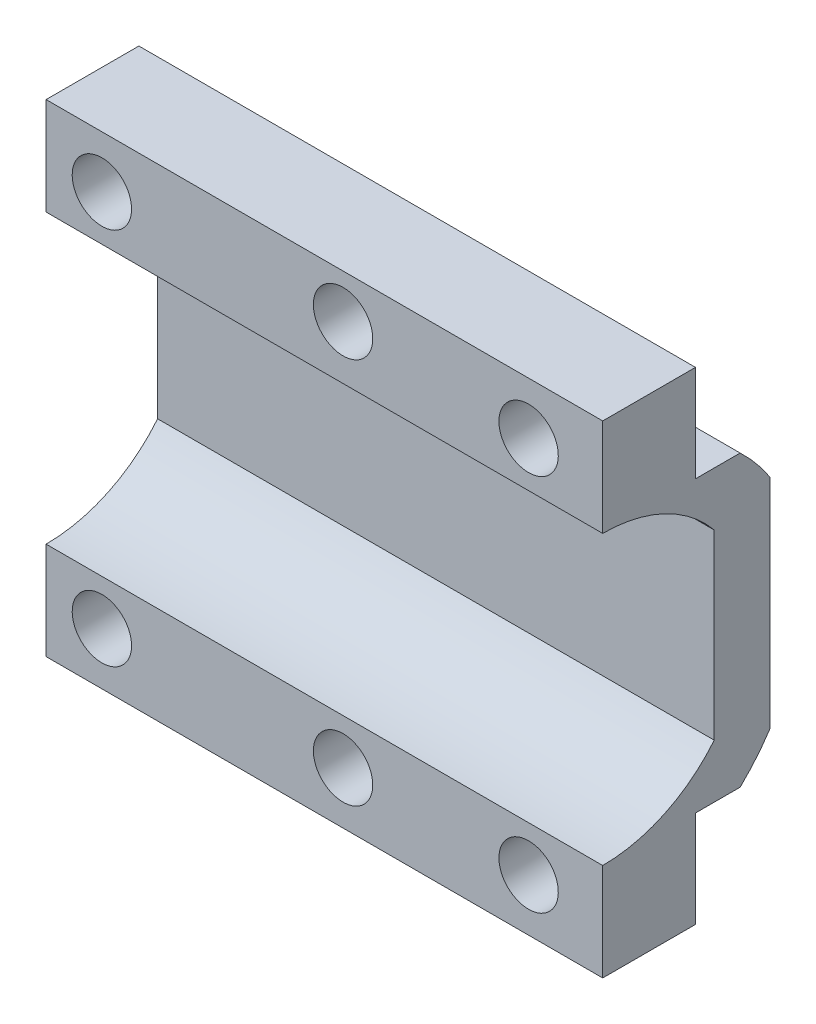
ISO-10303-21;
HEADER;
FILE_DESCRIPTION(('STEP AP214'),'2;1');
FILE_NAME('part.step','',(''),(''),'','','');
FILE_SCHEMA(('AUTOMOTIVE_DESIGN { 1 0 10303 214 1 1 1 1 }'));
ENDSEC;
DATA;
#1=APPLICATION_CONTEXT('core data for automotive mechanical design processes');
#2=APPLICATION_PROTOCOL_DEFINITION('international standard','automotive_design',2000,#1);
#3=PRODUCT_CONTEXT('',#1,'mechanical');
#4=PRODUCT('Part','Part','',(#3));
#5=PRODUCT_RELATED_PRODUCT_CATEGORY('part','',(#4));
#6=PRODUCT_DEFINITION_FORMATION('','',#4);
#7=PRODUCT_DEFINITION_CONTEXT('part definition',#1,'design');
#8=PRODUCT_DEFINITION('design','',#6,#7);
#9=PRODUCT_DEFINITION_SHAPE('','',#8);
#10=(LENGTH_UNIT() NAMED_UNIT(*) SI_UNIT(.MILLI.,.METRE.));
#11=(NAMED_UNIT(*) PLANE_ANGLE_UNIT() SI_UNIT($,.RADIAN.));
#12=(NAMED_UNIT(*) SI_UNIT($,.STERADIAN.) SOLID_ANGLE_UNIT());
#13=UNCERTAINTY_MEASURE_WITH_UNIT(LENGTH_MEASURE(1.E-05),#10,'distance_accuracy_value','');
#14=(GEOMETRIC_REPRESENTATION_CONTEXT(3) GLOBAL_UNCERTAINTY_ASSIGNED_CONTEXT((#13)) GLOBAL_UNIT_ASSIGNED_CONTEXT((#10,
#11,#12)) REPRESENTATION_CONTEXT('',''));
#15=CARTESIAN_POINT('',(0.,0.,0.));
#16=DIRECTION('',(0.,0.,1.));
#17=DIRECTION('',(1.,0.,0.));
#18=AXIS2_PLACEMENT_3D('',#15,#16,#17);
#19=CARTESIAN_POINT('',(181.804917,-142.707399523941,6.50999999999969));
#20=DIRECTION('',(0.,0.,-1.));
#21=DIRECTION('',(0.,1.,0.));
#22=AXIS2_PLACEMENT_3D('',#19,#20,#21);
#23=PLANE('',#22);
#24=CARTESIAN_POINT('',(197.82017,-119.066732,6.50999999999997));
#25=DIRECTION('',(0.,0.,-1.));
#26=DIRECTION('',(0.,1.,0.));
#27=AXIS2_PLACEMENT_3D('',#24,#25,#26);
#28=CIRCLE('',#27,1.6);
#29=CARTESIAN_POINT('',(197.82017,-117.466732,6.50999999999999));
#30=VERTEX_POINT('',#29);
#31=EDGE_CURVE('E279',#30,#30,#28,.F.);
#32=ORIENTED_EDGE('',*,*,#31,.F.);
#33=EDGE_LOOP('',(#32));
#34=FACE_BOUND('',#33,.T.);
#35=DIRECTION('',(1.,0.,0.));
#36=VECTOR('',#35,1.);
#37=CARTESIAN_POINT('',(181.814917,-121.955725451616,6.50999999999994));
#38=LINE('',#37,#36);
#39=CARTESIAN_POINT('',(181.814917,-121.955725451616,6.50999999999994));
#40=VERTEX_POINT('',#39);
#41=CARTESIAN_POINT('',(211.814917,-121.955725451616,6.50999999999994));
#42=VERTEX_POINT('',#41);
#43=EDGE_CURVE('E11',#40,#42,#38,.T.);
#44=ORIENTED_EDGE('',*,*,#43,.T.);
#45=DIRECTION('',(0.,1.,0.));
#46=VECTOR('',#45,1.);
#47=CARTESIAN_POINT('',(211.814917,-110.230703,6.51000000000008));
#48=LINE('',#47,#46);
#49=CARTESIAN_POINT('',(211.814917,-116.704038476059,6.51));
#50=VERTEX_POINT('',#49);
#51=EDGE_CURVE('E64',#42,#50,#48,.T.);
#52=ORIENTED_EDGE('',*,*,#51,.T.);
#53=DIRECTION('',(-1.,0.,0.));
#54=VECTOR('',#53,1.);
#55=CARTESIAN_POINT('',(181.814917,-116.704038476059,6.51));
#56=LINE('',#55,#54);
#57=CARTESIAN_POINT('',(181.814917,-116.704038476059,6.51));
#58=VERTEX_POINT('',#57);
#59=EDGE_CURVE('E54',#50,#58,#56,.T.);
#60=ORIENTED_EDGE('',*,*,#59,.T.);
#61=DIRECTION('',(0.,1.,0.));
#62=VECTOR('',#61,1.);
#63=CARTESIAN_POINT('',(181.814917,-129.705719,6.50999999999984));
#64=LINE('',#63,#62);
#65=EDGE_CURVE('E68',#40,#58,#64,.T.);
#66=ORIENTED_EDGE('',*,*,#65,.F.);
#67=EDGE_LOOP('',(#44,#52,#60,#66));
#68=FACE_BOUND('',#67,.T.);
#69=CARTESIAN_POINT('',(184.82017,-119.514706,6.50999999999997));
#70=DIRECTION('',(0.,0.,-1.));
#71=DIRECTION('',(0.,1.,0.));
#72=AXIS2_PLACEMENT_3D('',#69,#70,#71);
#73=CIRCLE('',#72,1.6);
#74=CARTESIAN_POINT('',(184.82017,-117.914706,6.50999999999999));
#75=VERTEX_POINT('',#74);
#76=EDGE_CURVE('E266',#75,#75,#73,.F.);
#77=ORIENTED_EDGE('',*,*,#76,.F.);
#78=EDGE_LOOP('',(#77));
#79=FACE_BOUND('',#78,.T.);
#80=CARTESIAN_POINT('',(207.82017,-119.514706,6.50999999999997));
#81=DIRECTION('',(0.,0.,-1.));
#82=DIRECTION('',(0.,1.,0.));
#83=AXIS2_PLACEMENT_3D('',#80,#81,#82);
#84=CIRCLE('',#83,1.6);
#85=CARTESIAN_POINT('',(207.82017,-117.914706,6.50999999999999));
#86=VERTEX_POINT('',#85);
#87=EDGE_CURVE('E282',#86,#86,#84,.F.);
#88=ORIENTED_EDGE('',*,*,#87,.F.);
#89=EDGE_LOOP('',(#88));
#90=FACE_BOUND('',#89,.T.);
#91=ADVANCED_FACE('F46',(#34,#68,#79,#90),#23,.F.);
#92=CARTESIAN_POINT('',(197.82017,-139.896732,6.50999999999972));
#93=DIRECTION('',(0.,0.,-1.));
#94=DIRECTION('',(0.,1.,0.));
#95=AXIS2_PLACEMENT_3D('',#92,#93,#94);
#96=CIRCLE('',#95,1.6);
#97=CARTESIAN_POINT('',(197.82017,-138.296732,6.50999999999974));
#98=VERTEX_POINT('',#97);
#99=EDGE_CURVE('E283',#98,#98,#96,.F.);
#100=ORIENTED_EDGE('',*,*,#99,.F.);
#101=EDGE_LOOP('',(#100));
#102=FACE_BOUND('',#101,.T.);
#103=DIRECTION('',(1.,0.,0.));
#104=VECTOR('',#103,1.);
#105=CARTESIAN_POINT('',(181.814917,-142.707399523941,6.50999999999969));
#106=LINE('',#105,#104);
#107=CARTESIAN_POINT('',(181.814917,-142.707399523941,6.50999999999984));
#108=VERTEX_POINT('',#107);
#109=CARTESIAN_POINT('',(211.814917,-142.707399523941,6.50999999999984));
#110=VERTEX_POINT('',#109);
#111=EDGE_CURVE('E269',#108,#110,#106,.T.);
#112=ORIENTED_EDGE('',*,*,#111,.T.);
#113=CARTESIAN_POINT('',(211.814917,-137.455712548384,6.50999999999975));
#114=VERTEX_POINT('',#113);
#115=EDGE_CURVE('E267',#110,#114,#48,.T.);
#116=ORIENTED_EDGE('',*,*,#115,.T.);
#117=DIRECTION('',(1.,0.,0.));
#118=VECTOR('',#117,1.);
#119=CARTESIAN_POINT('',(181.814917,-137.455712548384,6.50999999999975));
#120=LINE('',#119,#118);
#121=CARTESIAN_POINT('',(181.814917,-137.455712548384,6.50999999999975));
#122=VERTEX_POINT('',#121);
#123=EDGE_CURVE('E262',#122,#114,#120,.T.);
#124=ORIENTED_EDGE('',*,*,#123,.F.);
#125=EDGE_CURVE('E272',#108,#122,#64,.T.);
#126=ORIENTED_EDGE('',*,*,#125,.F.);
#127=EDGE_LOOP('',(#112,#116,#124,#126));
#128=FACE_BOUND('',#127,.T.);
#129=CARTESIAN_POINT('',(184.82017,-139.896732,6.50999999999972));
#130=DIRECTION('',(0.,0.,-1.));
#131=DIRECTION('',(0.,1.,0.));
#132=AXIS2_PLACEMENT_3D('',#129,#130,#131);
#133=CIRCLE('',#132,1.6);
#134=CARTESIAN_POINT('',(184.82017,-138.296732,6.50999999999974));
#135=VERTEX_POINT('',#134);
#136=EDGE_CURVE('E273',#135,#135,#133,.F.);
#137=ORIENTED_EDGE('',*,*,#136,.F.);
#138=EDGE_LOOP('',(#137));
#139=FACE_BOUND('',#138,.T.);
#140=CARTESIAN_POINT('',(207.82017,-139.896732,6.50999999999972));
#141=DIRECTION('',(0.,0.,-1.));
#142=DIRECTION('',(0.,1.,0.));
#143=AXIS2_PLACEMENT_3D('',#140,#141,#142);
#144=CIRCLE('',#143,1.6);
#145=CARTESIAN_POINT('',(207.82017,-138.296732,6.50999999999974));
#146=VERTEX_POINT('',#145);
#147=EDGE_CURVE('E49',#146,#146,#144,.F.);
#148=ORIENTED_EDGE('',*,*,#147,.F.);
#149=EDGE_LOOP('',(#148));
#150=FACE_BOUND('',#149,.T.);
#151=ADVANCED_FACE('F48',(#102,#128,#139,#150),#23,.F.);
#152=CARTESIAN_POINT('',(181.814917,-139.227399523941,1.50999999999954));
#153=DIRECTION('',(0.,0.,1.));
#154=DIRECTION('',(0.,-1.,0.));
#155=AXIS2_PLACEMENT_3D('',#152,#153,#154);
#156=PLANE('',#155);
#157=DIRECTION('',(1.,0.,0.));
#158=VECTOR('',#157,1.);
#159=CARTESIAN_POINT('',(181.814917,-137.505719,1.51));
#160=LINE('',#159,#158);
#161=CARTESIAN_POINT('',(181.814917,-137.505719,1.51));
#162=VERTEX_POINT('',#161);
#163=CARTESIAN_POINT('',(211.814917,-137.505719,1.51));
#164=VERTEX_POINT('',#163);
#165=EDGE_CURVE('E185',#162,#164,#160,.T.);
#166=ORIENTED_EDGE('',*,*,#165,.T.);
#167=DIRECTION('',(0.,-1.,0.));
#168=VECTOR('',#167,1.);
#169=CARTESIAN_POINT('',(211.814917,-139.227399523941,1.50999999999954));
#170=LINE('',#169,#168);
#171=CARTESIAN_POINT('',(211.814917,-142.707399523941,1.50999999999937));
#172=VERTEX_POINT('',#171);
#173=EDGE_CURVE('E188',#164,#172,#170,.T.);
#174=ORIENTED_EDGE('',*,*,#173,.T.);
#175=DIRECTION('',(1.,0.,0.));
#176=VECTOR('',#175,1.);
#177=CARTESIAN_POINT('',(181.814917,-142.707399523941,1.50999999999937));
#178=LINE('',#177,#176);
#179=CARTESIAN_POINT('',(181.814917,-142.707399523941,1.50999999999937));
#180=VERTEX_POINT('',#179);
#181=EDGE_CURVE('E180',#180,#172,#178,.T.);
#182=ORIENTED_EDGE('',*,*,#181,.F.);
#183=DIRECTION('',(0.,-1.,0.));
#184=VECTOR('',#183,1.);
#185=CARTESIAN_POINT('',(181.814917,-139.227399523941,1.50999999999954));
#186=LINE('',#185,#184);
#187=EDGE_CURVE('E192',#162,#180,#186,.T.);
#188=ORIENTED_EDGE('',*,*,#187,.F.);
#189=EDGE_LOOP('',(#166,#174,#182,#188));
#190=FACE_BOUND('',#189,.T.);
#191=CARTESIAN_POINT('',(184.82017,-139.896732,1.50999999999951));
#192=DIRECTION('',(0.,0.,1.));
#193=DIRECTION('',(0.,-1.,0.));
#194=AXIS2_PLACEMENT_3D('',#191,#192,#193);
#195=CIRCLE('',#194,1.6);
#196=CARTESIAN_POINT('',(184.82017,-141.496732,1.50999999999943));
#197=VERTEX_POINT('',#196);
#198=EDGE_CURVE('E258',#197,#197,#195,.F.);
#199=ORIENTED_EDGE('',*,*,#198,.F.);
#200=EDGE_LOOP('',(#199));
#201=FACE_BOUND('',#200,.T.);
#202=CARTESIAN_POINT('',(197.82017,-139.896732,1.50999999999951));
#203=DIRECTION('',(0.,0.,1.));
#204=DIRECTION('',(0.,-1.,0.));
#205=AXIS2_PLACEMENT_3D('',#202,#203,#204);
#206=CIRCLE('',#205,1.6);
#207=CARTESIAN_POINT('',(197.82017,-141.496732,1.50999999999943));
#208=VERTEX_POINT('',#207);
#209=EDGE_CURVE('E191',#208,#208,#206,.F.);
#210=ORIENTED_EDGE('',*,*,#209,.F.);
#211=EDGE_LOOP('',(#210));
#212=FACE_BOUND('',#211,.T.);
#213=CARTESIAN_POINT('',(207.82017,-139.896732,1.50999999999951));
#214=DIRECTION('',(0.,0.,1.));
#215=DIRECTION('',(0.,-1.,0.));
#216=AXIS2_PLACEMENT_3D('',#213,#214,#215);
#217=CIRCLE('',#216,1.6);
#218=CARTESIAN_POINT('',(207.82017,-141.496732,1.50999999999943));
#219=VERTEX_POINT('',#218);
#220=EDGE_CURVE('E205',#219,#219,#217,.F.);
#221=ORIENTED_EDGE('',*,*,#220,.F.);
#222=EDGE_LOOP('',(#221));
#223=FACE_BOUND('',#222,.T.);
#224=ADVANCED_FACE('F297',(#190,#201,#212,#223),#156,.F.);
#225=CARTESIAN_POINT('',(181.814917,-129.705719,6.5));
#226=DIRECTION('',(1.,0.,0.));
#227=DIRECTION('',(0.,0.,-1.));
#228=AXIS2_PLACEMENT_3D('',#225,#226,#227);
#229=CYLINDRICAL_SURFACE('',#228,10.75);
#230=DIRECTION('',(1.,0.,0.));
#231=VECTOR('',#230,1.);
#232=CARTESIAN_POINT('',(181.814917,-137.505719,-0.89746578227991));
#233=LINE('',#232,#231);
#234=CARTESIAN_POINT('',(181.814917,-137.505719,-0.89746578227991));
#235=VERTEX_POINT('',#234);
#236=CARTESIAN_POINT('',(211.814917,-137.505719,-0.89746578227991));
#237=VERTEX_POINT('',#236);
#238=EDGE_CURVE('E178',#235,#237,#233,.T.);
#239=ORIENTED_EDGE('',*,*,#238,.F.);
#240=CARTESIAN_POINT('',(181.814917,-129.705719,6.5));
#241=DIRECTION('',(1.,0.,0.));
#242=DIRECTION('',(0.,0.,-1.));
#243=AXIS2_PLACEMENT_3D('',#240,#241,#242);
#244=CIRCLE('',#243,10.75);
#245=CARTESIAN_POINT('',(181.814917,-135.584707008152,-2.5));
#246=VERTEX_POINT('',#245);
#247=EDGE_CURVE('E214',#235,#246,#244,.T.);
#248=ORIENTED_EDGE('',*,*,#247,.T.);
#249=DIRECTION('',(1.,0.,0.));
#250=VECTOR('',#249,1.);
#251=CARTESIAN_POINT('',(181.814917,-135.584707008152,-2.5));
#252=LINE('',#251,#250);
#253=CARTESIAN_POINT('',(211.814917,-135.584707008152,-2.5));
#254=VERTEX_POINT('',#253);
#255=EDGE_CURVE('E215',#246,#254,#252,.T.);
#256=ORIENTED_EDGE('',*,*,#255,.T.);
#257=CARTESIAN_POINT('',(211.814917,-129.705719,6.5));
#258=DIRECTION('',(1.,0.,0.));
#259=DIRECTION('',(0.,0.,-1.));
#260=AXIS2_PLACEMENT_3D('',#257,#258,#259);
#261=CIRCLE('',#260,10.75);
#262=EDGE_CURVE('E223',#237,#254,#261,.T.);
#263=ORIENTED_EDGE('',*,*,#262,.F.);
#264=EDGE_LOOP('',(#239,#248,#256,#263));
#265=FACE_BOUND('',#264,.T.);
#266=ADVANCED_FACE('F303',(#265),#229,.T.);
#267=CARTESIAN_POINT('',(181.814917,-123.826730991848,-2.5));
#268=DIRECTION('',(0.,0.,1.));
#269=DIRECTION('',(1.,0.,0.));
#270=AXIS2_PLACEMENT_3D('',#267,#268,#269);
#271=PLANE('',#270);
#272=DIRECTION('',(0.,-1.,0.));
#273=VECTOR('',#272,1.);
#274=CARTESIAN_POINT('',(211.814917,-123.826730991848,-2.5));
#275=LINE('',#274,#273);
#276=CARTESIAN_POINT('',(211.814917,-123.826730991848,-2.5));
#277=VERTEX_POINT('',#276);
#278=EDGE_CURVE('E218',#277,#254,#275,.T.);
#279=ORIENTED_EDGE('',*,*,#278,.T.);
#280=ORIENTED_EDGE('',*,*,#255,.F.);
#281=DIRECTION('',(0.,-1.,0.));
#282=VECTOR('',#281,1.);
#283=CARTESIAN_POINT('',(181.814917,-123.826730991848,-2.5));
#284=LINE('',#283,#282);
#285=CARTESIAN_POINT('',(181.814917,-123.826730991848,-2.5));
#286=VERTEX_POINT('',#285);
#287=EDGE_CURVE('E225',#286,#246,#284,.T.);
#288=ORIENTED_EDGE('',*,*,#287,.F.);
#289=DIRECTION('',(1.,0.,0.));
#290=VECTOR('',#289,1.);
#291=CARTESIAN_POINT('',(181.814917,-123.826730991848,-2.5));
#292=LINE('',#291,#290);
#293=EDGE_CURVE('E216',#286,#277,#292,.T.);
#294=ORIENTED_EDGE('',*,*,#293,.T.);
#295=EDGE_LOOP('',(#279,#280,#288,#294));
#296=FACE_BOUND('',#295,.T.);
#297=ADVANCED_FACE('F345',(#296),#271,.F.);
#298=CARTESIAN_POINT('',(181.814917,-142.707399523941,1.51));
#299=DIRECTION('',(0.,-1.,0.));
#300=DIRECTION('',(0.,0.,-1.));
#301=AXIS2_PLACEMENT_3D('',#298,#299,#300);
#302=PLANE('',#301);
#303=ORIENTED_EDGE('',*,*,#111,.F.);
#304=DIRECTION('',(0.,0.,-1.));
#305=VECTOR('',#304,1.);
#306=CARTESIAN_POINT('',(181.814917,-142.707399523941,1.51));
#307=LINE('',#306,#305);
#308=EDGE_CURVE('E234',#108,#180,#307,.T.);
#309=ORIENTED_EDGE('',*,*,#308,.T.);
#310=ORIENTED_EDGE('',*,*,#181,.T.);
#311=DIRECTION('',(0.,0.,-1.));
#312=VECTOR('',#311,1.);
#313=CARTESIAN_POINT('',(211.814917,-142.707399523941,1.51));
#314=LINE('',#313,#312);
#315=EDGE_CURVE('E229',#110,#172,#314,.T.);
#316=ORIENTED_EDGE('',*,*,#315,.F.);
#317=EDGE_LOOP('',(#303,#309,#310,#316));
#318=FACE_BOUND('',#317,.T.);
#319=ADVANCED_FACE('F347',(#318),#302,.T.);
#320=CARTESIAN_POINT('',(181.814917,-129.705719,6.5));
#321=DIRECTION('',(1.,0.,0.));
#322=DIRECTION('',(0.,0.,-1.));
#323=AXIS2_PLACEMENT_3D('',#320,#321,#322);
#324=CYLINDRICAL_SURFACE('',#323,10.75);
#325=CARTESIAN_POINT('',(181.814917,-129.705719,6.5));
#326=DIRECTION('',(-1.,0.,0.));
#327=DIRECTION('',(0.,0.,1.));
#328=AXIS2_PLACEMENT_3D('',#325,#326,#327);
#329=CIRCLE('',#328,10.75);
#330=CARTESIAN_POINT('',(181.814917,-121.905719,-0.897465782279862));
#331=VERTEX_POINT('',#330);
#332=EDGE_CURVE('E226',#331,#286,#329,.T.);
#333=ORIENTED_EDGE('',*,*,#332,.F.);
#334=DIRECTION('',(1.,0.,0.));
#335=VECTOR('',#334,1.);
#336=CARTESIAN_POINT('',(181.814917,-121.905719,-0.897465782279862));
#337=LINE('',#336,#335);
#338=CARTESIAN_POINT('',(211.814917,-121.905719,-0.897465782279862));
#339=VERTEX_POINT('',#338);
#340=EDGE_CURVE('E169',#331,#339,#337,.T.);
#341=ORIENTED_EDGE('',*,*,#340,.T.);
#342=CARTESIAN_POINT('',(211.814917,-129.705719,6.5));
#343=DIRECTION('',(-1.,0.,0.));
#344=DIRECTION('',(0.,0.,1.));
#345=AXIS2_PLACEMENT_3D('',#342,#343,#344);
#346=CIRCLE('',#345,10.75);
#347=EDGE_CURVE('E219',#339,#277,#346,.T.);
#348=ORIENTED_EDGE('',*,*,#347,.T.);
#349=ORIENTED_EDGE('',*,*,#293,.F.);
#350=EDGE_LOOP('',(#333,#341,#348,#349));
#351=FACE_BOUND('',#350,.T.);
#352=ADVANCED_FACE('F346',(#351),#324,.T.);
#353=CARTESIAN_POINT('',(181.814917,-120.184038476059,1.51));
#354=DIRECTION('',(0.,0.,-1.));
#355=DIRECTION('',(0.,1.,0.));
#356=AXIS2_PLACEMENT_3D('',#353,#354,#355);
#357=PLANE('',#356);
#358=CARTESIAN_POINT('',(184.82017,-119.514706,1.51));
#359=DIRECTION('',(0.,0.,-1.));
#360=DIRECTION('',(0.,1.,0.));
#361=AXIS2_PLACEMENT_3D('',#358,#359,#360);
#362=CIRCLE('',#361,1.6);
#363=CARTESIAN_POINT('',(184.82017,-117.914706,1.51));
#364=VERTEX_POINT('',#363);
#365=EDGE_CURVE('E261',#364,#364,#362,.F.);
#366=ORIENTED_EDGE('',*,*,#365,.T.);
#367=EDGE_LOOP('',(#366));
#368=FACE_BOUND('',#367,.T.);
#369=CARTESIAN_POINT('',(197.82017,-119.066732,1.51));
#370=DIRECTION('',(0.,0.,-1.));
#371=DIRECTION('',(0.,1.,0.));
#372=AXIS2_PLACEMENT_3D('',#369,#370,#371);
#373=CIRCLE('',#372,1.6);
#374=CARTESIAN_POINT('',(197.82017,-117.466732,1.51));
#375=VERTEX_POINT('',#374);
#376=EDGE_CURVE('E202',#375,#375,#373,.F.);
#377=ORIENTED_EDGE('',*,*,#376,.T.);
#378=EDGE_LOOP('',(#377));
#379=FACE_BOUND('',#378,.T.);
#380=CARTESIAN_POINT('',(207.82017,-119.514706,1.51));
#381=DIRECTION('',(0.,0.,-1.));
#382=DIRECTION('',(0.,1.,0.));
#383=AXIS2_PLACEMENT_3D('',#380,#381,#382);
#384=CIRCLE('',#383,1.6);
#385=CARTESIAN_POINT('',(207.82017,-117.914706,1.51));
#386=VERTEX_POINT('',#385);
#387=EDGE_CURVE('E208',#386,#386,#384,.F.);
#388=ORIENTED_EDGE('',*,*,#387,.T.);
#389=EDGE_LOOP('',(#388));
#390=FACE_BOUND('',#389,.T.);
#391=DIRECTION('',(1.,0.,0.));
#392=VECTOR('',#391,1.);
#393=CARTESIAN_POINT('',(181.814917,-121.905719,1.51));
#394=LINE('',#393,#392);
#395=CARTESIAN_POINT('',(181.814917,-121.905719,1.51));
#396=VERTEX_POINT('',#395);
#397=CARTESIAN_POINT('',(211.814917,-121.905719,1.51));
#398=VERTEX_POINT('',#397);
#399=EDGE_CURVE('E162',#396,#398,#394,.T.);
#400=ORIENTED_EDGE('',*,*,#399,.F.);
#401=DIRECTION('',(0.,1.,0.));
#402=VECTOR('',#401,1.);
#403=CARTESIAN_POINT('',(181.814917,-120.184038476059,1.51));
#404=LINE('',#403,#402);
#405=CARTESIAN_POINT('',(181.814917,-116.704038476059,1.51));
#406=VERTEX_POINT('',#405);
#407=EDGE_CURVE('E149',#396,#406,#404,.T.);
#408=ORIENTED_EDGE('',*,*,#407,.T.);
#409=DIRECTION('',(1.,0.,0.));
#410=VECTOR('',#409,1.);
#411=CARTESIAN_POINT('',(181.814917,-116.704038476059,1.51));
#412=LINE('',#411,#410);
#413=CARTESIAN_POINT('',(211.814917,-116.704038476059,1.51));
#414=VERTEX_POINT('',#413);
#415=EDGE_CURVE('E157',#406,#414,#412,.T.);
#416=ORIENTED_EDGE('',*,*,#415,.T.);
#417=DIRECTION('',(0.,1.,0.));
#418=VECTOR('',#417,1.);
#419=CARTESIAN_POINT('',(211.814917,-120.184038476059,1.51));
#420=LINE('',#419,#418);
#421=EDGE_CURVE('E159',#398,#414,#420,.T.);
#422=ORIENTED_EDGE('',*,*,#421,.F.);
#423=EDGE_LOOP('',(#400,#408,#416,#422));
#424=FACE_BOUND('',#423,.T.);
#425=ADVANCED_FACE('F163',(#368,#379,#390,#424),#357,.T.);
#426=CARTESIAN_POINT('',(181.814917,-134.611073217587,0.500000000000005));
#427=DIRECTION('',(0.,0.,-1.));
#428=DIRECTION('',(-1.,0.,0.));
#429=AXIS2_PLACEMENT_3D('',#426,#427,#428);
#430=PLANE('',#429);
#431=DIRECTION('',(0.,1.,0.));
#432=VECTOR('',#431,1.);
#433=CARTESIAN_POINT('',(211.814917,-134.611073217587,0.500000000000005));
#434=LINE('',#433,#432);
#435=CARTESIAN_POINT('',(211.814917,-134.611073217587,0.500000000000007));
#436=VERTEX_POINT('',#435);
#437=CARTESIAN_POINT('',(211.814917,-124.800364782413,0.500000000000005));
#438=VERTEX_POINT('',#437);
#439=EDGE_CURVE('E244',#436,#438,#434,.T.);
#440=ORIENTED_EDGE('',*,*,#439,.T.);
#441=DIRECTION('',(1.,0.,0.));
#442=VECTOR('',#441,1.);
#443=CARTESIAN_POINT('',(181.814917,-124.800364782413,0.500000000000005));
#444=LINE('',#443,#442);
#445=CARTESIAN_POINT('',(181.814917,-124.800364782413,0.500000000000005));
#446=VERTEX_POINT('',#445);
#447=EDGE_CURVE('E238',#446,#438,#444,.T.);
#448=ORIENTED_EDGE('',*,*,#447,.F.);
#449=DIRECTION('',(0.,1.,0.));
#450=VECTOR('',#449,1.);
#451=CARTESIAN_POINT('',(181.814917,-134.611073217587,0.500000000000005));
#452=LINE('',#451,#450);
#453=CARTESIAN_POINT('',(181.814917,-134.611073217587,0.500000000000007));
#454=VERTEX_POINT('',#453);
#455=EDGE_CURVE('E248',#454,#446,#452,.T.);
#456=ORIENTED_EDGE('',*,*,#455,.F.);
#457=DIRECTION('',(1.,0.,0.));
#458=VECTOR('',#457,1.);
#459=CARTESIAN_POINT('',(181.814917,-134.611073217587,0.500000000000007));
#460=LINE('',#459,#458);
#461=EDGE_CURVE('E241',#454,#436,#460,.T.);
#462=ORIENTED_EDGE('',*,*,#461,.T.);
#463=EDGE_LOOP('',(#440,#448,#456,#462));
#464=FACE_BOUND('',#463,.T.);
#465=ADVANCED_FACE('F336',(#464),#430,.F.);
#466=CARTESIAN_POINT('',(211.814917,-110.230703,0.));
#467=DIRECTION('',(1.,0.,0.));
#468=DIRECTION('',(0.,1.,0.));
#469=AXIS2_PLACEMENT_3D('',#466,#467,#468);
#470=PLANE('',#469);
#471=DIRECTION('',(0.,0.,-1.));
#472=VECTOR('',#471,1.);
#473=CARTESIAN_POINT('',(211.814917,-121.905719,1.51));
#474=LINE('',#473,#472);
#475=EDGE_CURVE('E175',#398,#339,#474,.T.);
#476=ORIENTED_EDGE('',*,*,#475,.F.);
#477=ORIENTED_EDGE('',*,*,#421,.T.);
#478=DIRECTION('',(0.,0.,1.));
#479=VECTOR('',#478,1.);
#480=CARTESIAN_POINT('',(211.814917,-116.704038476059,-28.49));
#481=LINE('',#480,#479);
#482=EDGE_CURVE('E240',#414,#50,#481,.T.);
#483=ORIENTED_EDGE('',*,*,#482,.T.);
#484=ORIENTED_EDGE('',*,*,#51,.F.);
#485=CARTESIAN_POINT('',(211.814917,-129.705719,6.5));
#486=DIRECTION('',(-1.,0.,0.));
#487=DIRECTION('',(0.,0.,1.));
#488=AXIS2_PLACEMENT_3D('',#485,#486,#487);
#489=CIRCLE('',#488,7.75000000000001);
#490=EDGE_CURVE('E211',#42,#438,#489,.T.);
#491=ORIENTED_EDGE('',*,*,#490,.T.);
#492=ORIENTED_EDGE('',*,*,#439,.F.);
#493=CARTESIAN_POINT('',(211.814917,-129.705719,6.5));
#494=DIRECTION('',(1.,0.,0.));
#495=DIRECTION('',(0.,0.,-1.));
#496=AXIS2_PLACEMENT_3D('',#493,#494,#495);
#497=CIRCLE('',#496,7.75000000000001);
#498=EDGE_CURVE('E246',#114,#436,#497,.T.);
#499=ORIENTED_EDGE('',*,*,#498,.F.);
#500=ORIENTED_EDGE('',*,*,#115,.F.);
#501=ORIENTED_EDGE('',*,*,#315,.T.);
#502=ORIENTED_EDGE('',*,*,#173,.F.);
#503=DIRECTION('',(0.,0.,1.));
#504=VECTOR('',#503,1.);
#505=CARTESIAN_POINT('',(211.814917,-137.505719,1.51));
#506=LINE('',#505,#504);
#507=EDGE_CURVE('E171',#237,#164,#506,.T.);
#508=ORIENTED_EDGE('',*,*,#507,.F.);
#509=ORIENTED_EDGE('',*,*,#262,.T.);
#510=ORIENTED_EDGE('',*,*,#278,.F.);
#511=ORIENTED_EDGE('',*,*,#347,.F.);
#512=EDGE_LOOP('',(#476,#477,#483,#484,#491,#492,#499,#500,#501,#502,#508,#509,#510,#511));
#513=FACE_BOUND('',#512,.T.);
#514=ADVANCED_FACE('F337',(#513),#470,.T.);
#515=CARTESIAN_POINT('',(181.814917,-129.705719,6.5));
#516=DIRECTION('',(1.,0.,0.));
#517=DIRECTION('',(0.,0.,-1.));
#518=AXIS2_PLACEMENT_3D('',#515,#516,#517);
#519=PLANE('',#518);
#520=ORIENTED_EDGE('',*,*,#407,.F.);
#521=DIRECTION('',(0.,0.,-1.));
#522=VECTOR('',#521,1.);
#523=CARTESIAN_POINT('',(181.814917,-121.905719,1.51));
#524=LINE('',#523,#522);
#525=EDGE_CURVE('E153',#396,#331,#524,.T.);
#526=ORIENTED_EDGE('',*,*,#525,.T.);
#527=ORIENTED_EDGE('',*,*,#332,.T.);
#528=ORIENTED_EDGE('',*,*,#287,.T.);
#529=ORIENTED_EDGE('',*,*,#247,.F.);
#530=DIRECTION('',(0.,0.,1.));
#531=VECTOR('',#530,1.);
#532=CARTESIAN_POINT('',(181.814917,-137.505719,1.51));
#533=LINE('',#532,#531);
#534=EDGE_CURVE('E182',#235,#162,#533,.T.);
#535=ORIENTED_EDGE('',*,*,#534,.T.);
#536=ORIENTED_EDGE('',*,*,#187,.T.);
#537=ORIENTED_EDGE('',*,*,#308,.F.);
#538=ORIENTED_EDGE('',*,*,#125,.T.);
#539=CARTESIAN_POINT('',(181.814917,-129.705719,6.5));
#540=DIRECTION('',(1.,0.,0.));
#541=DIRECTION('',(0.,0.,-1.));
#542=AXIS2_PLACEMENT_3D('',#539,#540,#541);
#543=CIRCLE('',#542,7.75000000000001);
#544=EDGE_CURVE('E230',#122,#454,#543,.T.);
#545=ORIENTED_EDGE('',*,*,#544,.T.);
#546=ORIENTED_EDGE('',*,*,#455,.T.);
#547=CARTESIAN_POINT('',(181.814917,-129.705719,6.5));
#548=DIRECTION('',(-1.,0.,0.));
#549=DIRECTION('',(0.,0.,1.));
#550=AXIS2_PLACEMENT_3D('',#547,#548,#549);
#551=CIRCLE('',#550,7.75000000000001);
#552=EDGE_CURVE('E239',#40,#446,#551,.T.);
#553=ORIENTED_EDGE('',*,*,#552,.F.);
#554=ORIENTED_EDGE('',*,*,#65,.T.);
#555=DIRECTION('',(0.,0.,1.));
#556=VECTOR('',#555,1.);
#557=CARTESIAN_POINT('',(181.814917,-116.704038476059,1.51));
#558=LINE('',#557,#556);
#559=EDGE_CURVE('E156',#406,#58,#558,.T.);
#560=ORIENTED_EDGE('',*,*,#559,.F.);
#561=EDGE_LOOP('',(#520,#526,#527,#528,#529,#535,#536,#537,#538,#545,#546,#553,#554,#560));
#562=FACE_BOUND('',#561,.T.);
#563=ADVANCED_FACE('F151',(#562),#519,.F.);
#564=CARTESIAN_POINT('',(181.814917,-129.705719,6.5));
#565=DIRECTION('',(1.,0.,0.));
#566=DIRECTION('',(0.,0.,-1.));
#567=AXIS2_PLACEMENT_3D('',#564,#565,#566);
#568=CYLINDRICAL_SURFACE('',#567,7.75000000000001);
#569=ORIENTED_EDGE('',*,*,#544,.F.);
#570=ORIENTED_EDGE('',*,*,#123,.T.);
#571=ORIENTED_EDGE('',*,*,#498,.T.);
#572=ORIENTED_EDGE('',*,*,#461,.F.);
#573=EDGE_LOOP('',(#569,#570,#571,#572));
#574=FACE_BOUND('',#573,.T.);
#575=ADVANCED_FACE('F351',(#574),#568,.F.);
#576=CARTESIAN_POINT('',(181.814917,-129.705719,6.5));
#577=DIRECTION('',(1.,0.,0.));
#578=DIRECTION('',(0.,0.,-1.));
#579=AXIS2_PLACEMENT_3D('',#576,#577,#578);
#580=CYLINDRICAL_SURFACE('',#579,7.75000000000001);
#581=ORIENTED_EDGE('',*,*,#43,.F.);
#582=ORIENTED_EDGE('',*,*,#552,.T.);
#583=ORIENTED_EDGE('',*,*,#447,.T.);
#584=ORIENTED_EDGE('',*,*,#490,.F.);
#585=EDGE_LOOP('',(#581,#582,#583,#584));
#586=FACE_BOUND('',#585,.T.);
#587=ADVANCED_FACE('F356',(#586),#580,.F.);
#588=CARTESIAN_POINT('',(181.814917,-116.704038476059,1.51));
#589=DIRECTION('',(0.,1.,0.));
#590=DIRECTION('',(0.,0.,1.));
#591=AXIS2_PLACEMENT_3D('',#588,#589,#590);
#592=PLANE('',#591);
#593=ORIENTED_EDGE('',*,*,#59,.F.);
#594=ORIENTED_EDGE('',*,*,#482,.F.);
#595=ORIENTED_EDGE('',*,*,#415,.F.);
#596=ORIENTED_EDGE('',*,*,#559,.T.);
#597=EDGE_LOOP('',(#593,#594,#595,#596));
#598=FACE_BOUND('',#597,.T.);
#599=ADVANCED_FACE('F330',(#598),#592,.T.);
#600=CARTESIAN_POINT('',(184.82017,-119.514706,0.));
#601=DIRECTION('',(0.,0.,-1.));
#602=DIRECTION('',(1.,0.,0.));
#603=AXIS2_PLACEMENT_3D('',#600,#601,#602);
#604=CYLINDRICAL_SURFACE('',#603,1.6);
#605=ORIENTED_EDGE('',*,*,#76,.T.);
#606=EDGE_LOOP('',(#605));
#607=FACE_BOUND('',#606,.T.);
#608=ORIENTED_EDGE('',*,*,#365,.F.);
#609=EDGE_LOOP('',(#608));
#610=FACE_BOUND('',#609,.T.);
#611=ADVANCED_FACE('F322',(#607,#610),#604,.F.);
#612=CARTESIAN_POINT('',(197.82017,-119.066732,0.));
#613=DIRECTION('',(0.,0.,-1.));
#614=DIRECTION('',(1.,0.,0.));
#615=AXIS2_PLACEMENT_3D('',#612,#613,#614);
#616=CYLINDRICAL_SURFACE('',#615,1.6);
#617=ORIENTED_EDGE('',*,*,#31,.T.);
#618=EDGE_LOOP('',(#617));
#619=FACE_BOUND('',#618,.T.);
#620=ORIENTED_EDGE('',*,*,#376,.F.);
#621=EDGE_LOOP('',(#620));
#622=FACE_BOUND('',#621,.T.);
#623=ADVANCED_FACE('F326',(#619,#622),#616,.F.);
#624=CARTESIAN_POINT('',(207.82017,-119.514706,0.));
#625=DIRECTION('',(0.,0.,-1.));
#626=DIRECTION('',(1.,0.,0.));
#627=AXIS2_PLACEMENT_3D('',#624,#625,#626);
#628=CYLINDRICAL_SURFACE('',#627,1.6);
#629=ORIENTED_EDGE('',*,*,#87,.T.);
#630=EDGE_LOOP('',(#629));
#631=FACE_BOUND('',#630,.T.);
#632=ORIENTED_EDGE('',*,*,#387,.F.);
#633=EDGE_LOOP('',(#632));
#634=FACE_BOUND('',#633,.T.);
#635=ADVANCED_FACE('F323',(#631,#634),#628,.F.);
#636=CARTESIAN_POINT('',(184.82017,-139.896732,0.));
#637=DIRECTION('',(0.,0.,-1.));
#638=DIRECTION('',(1.,0.,0.));
#639=AXIS2_PLACEMENT_3D('',#636,#637,#638);
#640=CYLINDRICAL_SURFACE('',#639,1.6);
#641=ORIENTED_EDGE('',*,*,#136,.T.);
#642=EDGE_LOOP('',(#641));
#643=FACE_BOUND('',#642,.T.);
#644=ORIENTED_EDGE('',*,*,#198,.T.);
#645=EDGE_LOOP('',(#644));
#646=FACE_BOUND('',#645,.T.);
#647=ADVANCED_FACE('F317',(#643,#646),#640,.F.);
#648=CARTESIAN_POINT('',(197.82017,-139.896732,0.));
#649=DIRECTION('',(0.,0.,-1.));
#650=DIRECTION('',(1.,0.,0.));
#651=AXIS2_PLACEMENT_3D('',#648,#649,#650);
#652=CYLINDRICAL_SURFACE('',#651,1.6);
#653=ORIENTED_EDGE('',*,*,#99,.T.);
#654=EDGE_LOOP('',(#653));
#655=FACE_BOUND('',#654,.T.);
#656=ORIENTED_EDGE('',*,*,#209,.T.);
#657=EDGE_LOOP('',(#656));
#658=FACE_BOUND('',#657,.T.);
#659=ADVANCED_FACE('F313',(#655,#658),#652,.F.);
#660=CARTESIAN_POINT('',(207.82017,-139.896732,0.));
#661=DIRECTION('',(0.,0.,-1.));
#662=DIRECTION('',(1.,0.,0.));
#663=AXIS2_PLACEMENT_3D('',#660,#661,#662);
#664=CYLINDRICAL_SURFACE('',#663,1.6);
#665=ORIENTED_EDGE('',*,*,#147,.T.);
#666=EDGE_LOOP('',(#665));
#667=FACE_BOUND('',#666,.T.);
#668=ORIENTED_EDGE('',*,*,#220,.T.);
#669=EDGE_LOOP('',(#668));
#670=FACE_BOUND('',#669,.T.);
#671=ADVANCED_FACE('F295',(#667,#670),#664,.F.);
#672=CARTESIAN_POINT('',(181.814917,-137.505719,1.51));
#673=DIRECTION('',(0.,1.,0.));
#674=DIRECTION('',(0.,0.,1.));
#675=AXIS2_PLACEMENT_3D('',#672,#673,#674);
#676=PLANE('',#675);
#677=ORIENTED_EDGE('',*,*,#507,.T.);
#678=ORIENTED_EDGE('',*,*,#165,.F.);
#679=ORIENTED_EDGE('',*,*,#534,.F.);
#680=ORIENTED_EDGE('',*,*,#238,.T.);
#681=EDGE_LOOP('',(#677,#678,#679,#680));
#682=FACE_BOUND('',#681,.T.);
#683=ADVANCED_FACE('F307',(#682),#676,.F.);
#684=CARTESIAN_POINT('',(181.814917,-121.905719,1.51));
#685=DIRECTION('',(0.,-1.,0.));
#686=DIRECTION('',(0.,0.,-1.));
#687=AXIS2_PLACEMENT_3D('',#684,#685,#686);
#688=PLANE('',#687);
#689=ORIENTED_EDGE('',*,*,#475,.T.);
#690=ORIENTED_EDGE('',*,*,#340,.F.);
#691=ORIENTED_EDGE('',*,*,#525,.F.);
#692=ORIENTED_EDGE('',*,*,#399,.T.);
#693=EDGE_LOOP('',(#689,#690,#691,#692));
#694=FACE_BOUND('',#693,.T.);
#695=ADVANCED_FACE('F168',(#694),#688,.F.);
#696=CLOSED_SHELL('',(#91,#151,#224,#266,#297,#319,#352,#425,#465,#514,#563,#575,#587,#599,#611,
#623,#635,#647,#659,#671,#683,#695));
#697=MANIFOLD_SOLID_BREP('B2',#696);
#698=ADVANCED_BREP_SHAPE_REPRESENTATION('',(#18,#697),#14);
#699=SHAPE_DEFINITION_REPRESENTATION(#9,#698);
ENDSEC;
END-ISO-10303-21;
